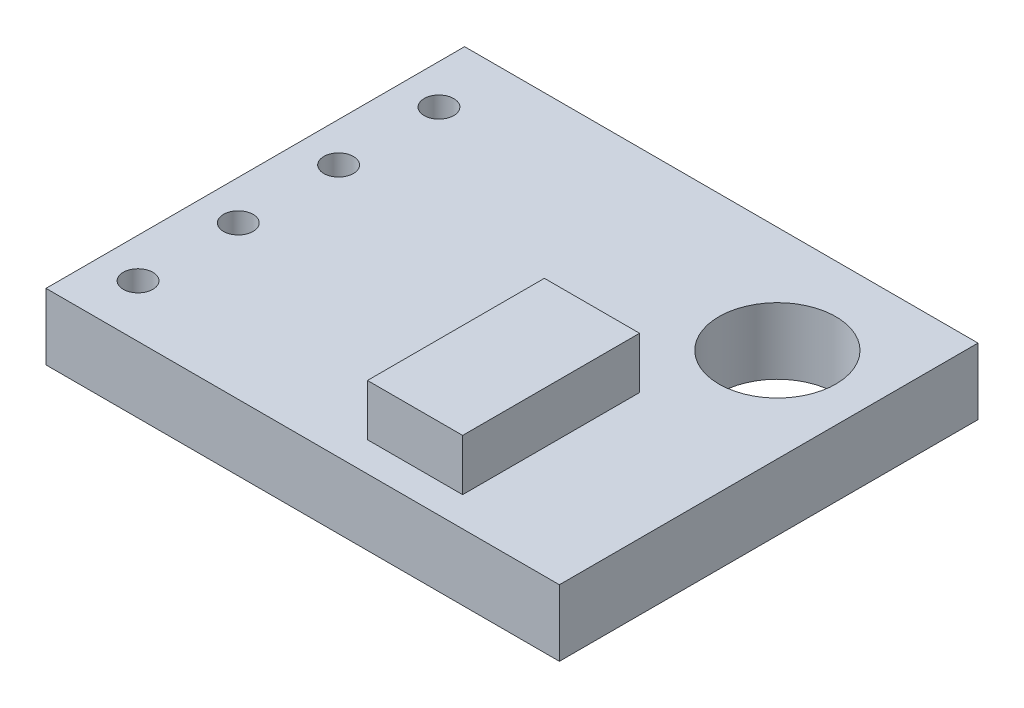
ISO-10303-21;
HEADER;
FILE_DESCRIPTION(('STEP AP214'),'2;1');
FILE_NAME('part.step','',(''),(''),'','','');
FILE_SCHEMA(('AUTOMOTIVE_DESIGN { 1 0 10303 214 1 1 1 1 }'));
ENDSEC;
DATA;
#1=APPLICATION_CONTEXT('core data for automotive mechanical design processes');
#2=APPLICATION_PROTOCOL_DEFINITION('international standard','automotive_design',2000,#1);
#3=PRODUCT_CONTEXT('',#1,'mechanical');
#4=PRODUCT('Part','Part','',(#3));
#5=PRODUCT_RELATED_PRODUCT_CATEGORY('part','',(#4));
#6=PRODUCT_DEFINITION_FORMATION('','',#4);
#7=PRODUCT_DEFINITION_CONTEXT('part definition',#1,'design');
#8=PRODUCT_DEFINITION('design','',#6,#7);
#9=PRODUCT_DEFINITION_SHAPE('','',#8);
#10=(LENGTH_UNIT() NAMED_UNIT(*) SI_UNIT(.MILLI.,.METRE.));
#11=(NAMED_UNIT(*) PLANE_ANGLE_UNIT() SI_UNIT($,.RADIAN.));
#12=(NAMED_UNIT(*) SI_UNIT($,.STERADIAN.) SOLID_ANGLE_UNIT());
#13=UNCERTAINTY_MEASURE_WITH_UNIT(LENGTH_MEASURE(1.E-05),#10,'distance_accuracy_value','');
#14=(GEOMETRIC_REPRESENTATION_CONTEXT(3) GLOBAL_UNCERTAINTY_ASSIGNED_CONTEXT((#13)) GLOBAL_UNIT_ASSIGNED_CONTEXT((#10,
#11,#12)) REPRESENTATION_CONTEXT('',''));
#15=CARTESIAN_POINT('',(0.,0.,0.));
#16=DIRECTION('',(0.,0.,1.));
#17=DIRECTION('',(1.,0.,0.));
#18=AXIS2_PLACEMENT_3D('',#15,#16,#17);
#19=CARTESIAN_POINT('',(6.5,1.68,-5.3));
#20=DIRECTION('',(-1.,0.,0.));
#21=DIRECTION('',(0.,0.,1.));
#22=AXIS2_PLACEMENT_3D('',#19,#20,#21);
#23=PLANE('',#22);
#24=DIRECTION('',(0.,0.,-1.));
#25=VECTOR('',#24,1.);
#26=CARTESIAN_POINT('',(6.5,0.,-5.3));
#27=LINE('',#26,#25);
#28=CARTESIAN_POINT('',(6.5,0.,5.3));
#29=VERTEX_POINT('',#28);
#30=CARTESIAN_POINT('',(6.5,0.,-5.3));
#31=VERTEX_POINT('',#30);
#32=EDGE_CURVE('E117',#29,#31,#27,.T.);
#33=ORIENTED_EDGE('',*,*,#32,.T.);
#34=DIRECTION('',(0.,-1.,0.));
#35=VECTOR('',#34,1.);
#36=CARTESIAN_POINT('',(6.5,1.68,-5.3));
#37=LINE('',#36,#35);
#38=CARTESIAN_POINT('',(6.5,1.68,-5.3));
#39=VERTEX_POINT('',#38);
#40=EDGE_CURVE('E11',#39,#31,#37,.T.);
#41=ORIENTED_EDGE('',*,*,#40,.F.);
#42=DIRECTION('',(0.,0.,-1.));
#43=VECTOR('',#42,1.);
#44=CARTESIAN_POINT('',(6.5,1.68,-5.3));
#45=LINE('',#44,#43);
#46=CARTESIAN_POINT('',(6.5,1.68,5.3));
#47=VERTEX_POINT('',#46);
#48=EDGE_CURVE('E126',#47,#39,#45,.T.);
#49=ORIENTED_EDGE('',*,*,#48,.F.);
#50=DIRECTION('',(0.,-1.,0.));
#51=VECTOR('',#50,1.);
#52=CARTESIAN_POINT('',(6.5,1.68,5.3));
#53=LINE('',#52,#51);
#54=EDGE_CURVE('E135',#47,#29,#53,.T.);
#55=ORIENTED_EDGE('',*,*,#54,.T.);
#56=EDGE_LOOP('',(#33,#41,#49,#55));
#57=FACE_BOUND('',#56,.T.);
#58=ADVANCED_FACE('F33',(#57),#23,.F.);
#59=CARTESIAN_POINT('',(-6.5,1.68,-5.3));
#60=DIRECTION('',(0.,0.,1.));
#61=DIRECTION('',(1.,0.,0.));
#62=AXIS2_PLACEMENT_3D('',#59,#60,#61);
#63=PLANE('',#62);
#64=DIRECTION('',(-1.,0.,0.));
#65=VECTOR('',#64,1.);
#66=CARTESIAN_POINT('',(-6.5,0.,-5.3));
#67=LINE('',#66,#65);
#68=CARTESIAN_POINT('',(-6.5,0.,-5.3));
#69=VERTEX_POINT('',#68);
#70=EDGE_CURVE('E120',#31,#69,#67,.T.);
#71=ORIENTED_EDGE('',*,*,#70,.T.);
#72=DIRECTION('',(0.,-1.,0.));
#73=VECTOR('',#72,1.);
#74=CARTESIAN_POINT('',(-6.5,1.68,-5.3));
#75=LINE('',#74,#73);
#76=CARTESIAN_POINT('',(-6.5,1.68,-5.3));
#77=VERTEX_POINT('',#76);
#78=EDGE_CURVE('E40',#77,#69,#75,.T.);
#79=ORIENTED_EDGE('',*,*,#78,.F.);
#80=DIRECTION('',(-1.,0.,0.));
#81=VECTOR('',#80,1.);
#82=CARTESIAN_POINT('',(-6.5,1.68,-5.3));
#83=LINE('',#82,#81);
#84=EDGE_CURVE('E129',#39,#77,#83,.T.);
#85=ORIENTED_EDGE('',*,*,#84,.F.);
#86=ORIENTED_EDGE('',*,*,#40,.T.);
#87=EDGE_LOOP('',(#71,#79,#85,#86));
#88=FACE_BOUND('',#87,.T.);
#89=ADVANCED_FACE('F166',(#88),#63,.F.);
#90=CARTESIAN_POINT('',(-6.5,1.68,-5.3));
#91=DIRECTION('',(1.,0.,0.));
#92=DIRECTION('',(0.,0.,-1.));
#93=AXIS2_PLACEMENT_3D('',#90,#91,#92);
#94=PLANE('',#93);
#95=DIRECTION('',(0.,0.,1.));
#96=VECTOR('',#95,1.);
#97=CARTESIAN_POINT('',(-6.5,0.,-5.3));
#98=LINE('',#97,#96);
#99=CARTESIAN_POINT('',(-6.5,0.,5.3));
#100=VERTEX_POINT('',#99);
#101=EDGE_CURVE('E138',#69,#100,#98,.T.);
#102=ORIENTED_EDGE('',*,*,#101,.T.);
#103=DIRECTION('',(0.,-1.,0.));
#104=VECTOR('',#103,1.);
#105=CARTESIAN_POINT('',(-6.5,1.68,5.3));
#106=LINE('',#105,#104);
#107=CARTESIAN_POINT('',(-6.5,1.68,5.3));
#108=VERTEX_POINT('',#107);
#109=EDGE_CURVE('E143',#108,#100,#106,.T.);
#110=ORIENTED_EDGE('',*,*,#109,.F.);
#111=DIRECTION('',(0.,0.,1.));
#112=VECTOR('',#111,1.);
#113=CARTESIAN_POINT('',(-6.5,1.68,-5.3));
#114=LINE('',#113,#112);
#115=EDGE_CURVE('E132',#77,#108,#114,.T.);
#116=ORIENTED_EDGE('',*,*,#115,.F.);
#117=ORIENTED_EDGE('',*,*,#78,.T.);
#118=EDGE_LOOP('',(#102,#110,#116,#117));
#119=FACE_BOUND('',#118,.T.);
#120=ADVANCED_FACE('F150',(#119),#94,.F.);
#121=CARTESIAN_POINT('',(-6.5,1.68,5.3));
#122=DIRECTION('',(0.,0.,-1.));
#123=DIRECTION('',(-1.,0.,0.));
#124=AXIS2_PLACEMENT_3D('',#121,#122,#123);
#125=PLANE('',#124);
#126=DIRECTION('',(1.,0.,0.));
#127=VECTOR('',#126,1.);
#128=CARTESIAN_POINT('',(-6.5,0.,5.3));
#129=LINE('',#128,#127);
#130=EDGE_CURVE('E130',#100,#29,#129,.T.);
#131=ORIENTED_EDGE('',*,*,#130,.T.);
#132=ORIENTED_EDGE('',*,*,#54,.F.);
#133=DIRECTION('',(1.,0.,0.));
#134=VECTOR('',#133,1.);
#135=CARTESIAN_POINT('',(-6.5,1.68,5.3));
#136=LINE('',#135,#134);
#137=EDGE_CURVE('E134',#108,#47,#136,.T.);
#138=ORIENTED_EDGE('',*,*,#137,.F.);
#139=ORIENTED_EDGE('',*,*,#109,.T.);
#140=EDGE_LOOP('',(#131,#132,#138,#139));
#141=FACE_BOUND('',#140,.T.);
#142=ADVANCED_FACE('F159',(#141),#125,.F.);
#143=CARTESIAN_POINT('',(0.,1.68,0.));
#144=DIRECTION('',(0.,1.,0.));
#145=DIRECTION('',(0.,0.,1.));
#146=AXIS2_PLACEMENT_3D('',#143,#144,#145);
#147=PLANE('',#146);
#148=CARTESIAN_POINT('',(-5.5,1.68,-3.65));
#149=DIRECTION('',(0.,1.,0.));
#150=DIRECTION('',(0.,0.,1.));
#151=AXIS2_PLACEMENT_3D('',#148,#149,#150);
#152=CIRCLE('',#151,0.375);
#153=CARTESIAN_POINT('',(-5.5,1.68,-3.275));
#154=VERTEX_POINT('',#153);
#155=EDGE_CURVE('E223',#154,#154,#152,.T.);
#156=ORIENTED_EDGE('',*,*,#155,.F.);
#157=EDGE_LOOP('',(#156));
#158=FACE_BOUND('',#157,.T.);
#159=CARTESIAN_POINT('',(-5.49999999999997,1.68,-1.11));
#160=DIRECTION('',(0.,1.,0.));
#161=DIRECTION('',(0.,0.,1.));
#162=AXIS2_PLACEMENT_3D('',#159,#160,#161);
#163=CIRCLE('',#162,0.375);
#164=CARTESIAN_POINT('',(-5.49999999999997,1.68,-0.735));
#165=VERTEX_POINT('',#164);
#166=EDGE_CURVE('E229',#165,#165,#163,.T.);
#167=ORIENTED_EDGE('',*,*,#166,.F.);
#168=EDGE_LOOP('',(#167));
#169=FACE_BOUND('',#168,.T.);
#170=CARTESIAN_POINT('',(-5.49999999999995,1.68,1.43));
#171=DIRECTION('',(0.,1.,0.));
#172=DIRECTION('',(0.,0.,1.));
#173=AXIS2_PLACEMENT_3D('',#170,#171,#172);
#174=CIRCLE('',#173,0.375);
#175=CARTESIAN_POINT('',(-5.49999999999995,1.68,1.805));
#176=VERTEX_POINT('',#175);
#177=EDGE_CURVE('E237',#176,#176,#174,.T.);
#178=ORIENTED_EDGE('',*,*,#177,.F.);
#179=EDGE_LOOP('',(#178));
#180=FACE_BOUND('',#179,.T.);
#181=CARTESIAN_POINT('',(-5.49999999999992,1.68,3.97));
#182=DIRECTION('',(0.,1.,0.));
#183=DIRECTION('',(0.,0.,1.));
#184=AXIS2_PLACEMENT_3D('',#181,#182,#183);
#185=CIRCLE('',#184,0.375);
#186=CARTESIAN_POINT('',(-5.49999999999992,1.68,4.345));
#187=VERTEX_POINT('',#186);
#188=EDGE_CURVE('E243',#187,#187,#185,.T.);
#189=ORIENTED_EDGE('',*,*,#188,.F.);
#190=EDGE_LOOP('',(#189));
#191=FACE_BOUND('',#190,.T.);
#192=CARTESIAN_POINT('',(4.12,1.68,-2.6));
#193=DIRECTION('',(0.,1.,0.));
#194=DIRECTION('',(0.,0.,1.));
#195=AXIS2_PLACEMENT_3D('',#192,#193,#194);
#196=CIRCLE('',#195,1.48);
#197=CARTESIAN_POINT('',(4.12,1.68,-1.12));
#198=VERTEX_POINT('',#197);
#199=EDGE_CURVE('E226',#198,#198,#196,.T.);
#200=ORIENTED_EDGE('',*,*,#199,.F.);
#201=EDGE_LOOP('',(#200));
#202=FACE_BOUND('',#201,.T.);
#203=DIRECTION('',(0.,0.,-1.));
#204=VECTOR('',#203,1.);
#205=CARTESIAN_POINT('',(3.3,1.68,0.0699999999999998));
#206=LINE('',#205,#204);
#207=CARTESIAN_POINT('',(3.3,1.68,4.55));
#208=VERTEX_POINT('',#207);
#209=CARTESIAN_POINT('',(3.3,1.68,0.0699999999999998));
#210=VERTEX_POINT('',#209);
#211=EDGE_CURVE('E47',#208,#210,#206,.T.);
#212=ORIENTED_EDGE('',*,*,#211,.F.);
#213=DIRECTION('',(1.,0.,0.));
#214=VECTOR('',#213,1.);
#215=CARTESIAN_POINT('',(0.890000000000001,1.68,4.55));
#216=LINE('',#215,#214);
#217=CARTESIAN_POINT('',(0.890000000000001,1.68,4.55));
#218=VERTEX_POINT('',#217);
#219=EDGE_CURVE('E51',#218,#208,#216,.T.);
#220=ORIENTED_EDGE('',*,*,#219,.F.);
#221=DIRECTION('',(0.,0.,1.));
#222=VECTOR('',#221,1.);
#223=CARTESIAN_POINT('',(0.89,1.68,0.0699999999999998));
#224=LINE('',#223,#222);
#225=CARTESIAN_POINT('',(0.89,1.68,0.0699999999999998));
#226=VERTEX_POINT('',#225);
#227=EDGE_CURVE('E257',#226,#218,#224,.T.);
#228=ORIENTED_EDGE('',*,*,#227,.F.);
#229=DIRECTION('',(-1.,0.,0.));
#230=VECTOR('',#229,1.);
#231=CARTESIAN_POINT('',(0.89,1.68,0.0699999999999998));
#232=LINE('',#231,#230);
#233=EDGE_CURVE('E255',#210,#226,#232,.T.);
#234=ORIENTED_EDGE('',*,*,#233,.F.);
#235=EDGE_LOOP('',(#212,#220,#228,#234));
#236=FACE_BOUND('',#235,.T.);
#237=ORIENTED_EDGE('',*,*,#48,.T.);
#238=ORIENTED_EDGE('',*,*,#84,.T.);
#239=ORIENTED_EDGE('',*,*,#115,.T.);
#240=ORIENTED_EDGE('',*,*,#137,.T.);
#241=EDGE_LOOP('',(#237,#238,#239,#240));
#242=FACE_BOUND('',#241,.T.);
#243=ADVANCED_FACE('F165',(#158,#169,#180,#191,#202,#236,#242),#147,.T.);
#244=CARTESIAN_POINT('',(0.,0.,0.));
#245=DIRECTION('',(0.,1.,0.));
#246=DIRECTION('',(0.,0.,1.));
#247=AXIS2_PLACEMENT_3D('',#244,#245,#246);
#248=PLANE('',#247);
#249=CARTESIAN_POINT('',(-5.5,0.,-3.65));
#250=DIRECTION('',(0.,1.,0.));
#251=DIRECTION('',(0.,0.,1.));
#252=AXIS2_PLACEMENT_3D('',#249,#250,#251);
#253=CIRCLE('',#252,0.375);
#254=CARTESIAN_POINT('',(-5.5,0.,-3.275));
#255=VERTEX_POINT('',#254);
#256=EDGE_CURVE('E220',#255,#255,#253,.T.);
#257=ORIENTED_EDGE('',*,*,#256,.T.);
#258=EDGE_LOOP('',(#257));
#259=FACE_BOUND('',#258,.T.);
#260=CARTESIAN_POINT('',(-5.49999999999997,0.,-1.11));
#261=DIRECTION('',(0.,1.,0.));
#262=DIRECTION('',(0.,0.,1.));
#263=AXIS2_PLACEMENT_3D('',#260,#261,#262);
#264=CIRCLE('',#263,0.375);
#265=CARTESIAN_POINT('',(-5.49999999999997,0.,-0.735));
#266=VERTEX_POINT('',#265);
#267=EDGE_CURVE('E224',#266,#266,#264,.T.);
#268=ORIENTED_EDGE('',*,*,#267,.T.);
#269=EDGE_LOOP('',(#268));
#270=FACE_BOUND('',#269,.T.);
#271=CARTESIAN_POINT('',(-5.49999999999995,0.,1.43));
#272=DIRECTION('',(0.,1.,0.));
#273=DIRECTION('',(0.,0.,1.));
#274=AXIS2_PLACEMENT_3D('',#271,#272,#273);
#275=CIRCLE('',#274,0.375);
#276=CARTESIAN_POINT('',(-5.49999999999995,0.,1.805));
#277=VERTEX_POINT('',#276);
#278=EDGE_CURVE('E234',#277,#277,#275,.T.);
#279=ORIENTED_EDGE('',*,*,#278,.T.);
#280=EDGE_LOOP('',(#279));
#281=FACE_BOUND('',#280,.T.);
#282=CARTESIAN_POINT('',(-5.49999999999992,0.,3.97));
#283=DIRECTION('',(0.,1.,0.));
#284=DIRECTION('',(0.,0.,1.));
#285=AXIS2_PLACEMENT_3D('',#282,#283,#284);
#286=CIRCLE('',#285,0.375);
#287=CARTESIAN_POINT('',(-5.49999999999992,0.,4.345));
#288=VERTEX_POINT('',#287);
#289=EDGE_CURVE('E240',#288,#288,#286,.T.);
#290=ORIENTED_EDGE('',*,*,#289,.T.);
#291=EDGE_LOOP('',(#290));
#292=FACE_BOUND('',#291,.T.);
#293=CARTESIAN_POINT('',(4.12,0.,-2.6));
#294=DIRECTION('',(0.,1.,0.));
#295=DIRECTION('',(0.,0.,1.));
#296=AXIS2_PLACEMENT_3D('',#293,#294,#295);
#297=CIRCLE('',#296,1.48);
#298=CARTESIAN_POINT('',(4.12,0.,-1.12));
#299=VERTEX_POINT('',#298);
#300=EDGE_CURVE('E246',#299,#299,#297,.T.);
#301=ORIENTED_EDGE('',*,*,#300,.T.);
#302=EDGE_LOOP('',(#301));
#303=FACE_BOUND('',#302,.T.);
#304=ORIENTED_EDGE('',*,*,#32,.F.);
#305=ORIENTED_EDGE('',*,*,#130,.F.);
#306=ORIENTED_EDGE('',*,*,#101,.F.);
#307=ORIENTED_EDGE('',*,*,#70,.F.);
#308=EDGE_LOOP('',(#304,#305,#306,#307));
#309=FACE_BOUND('',#308,.T.);
#310=ADVANCED_FACE('F156',(#259,#270,#281,#292,#303,#309),#248,.F.);
#311=CARTESIAN_POINT('',(3.3,2.98,0.0699999999999998));
#312=DIRECTION('',(-1.,0.,0.));
#313=DIRECTION('',(0.,0.,1.));
#314=AXIS2_PLACEMENT_3D('',#311,#312,#313);
#315=PLANE('',#314);
#316=ORIENTED_EDGE('',*,*,#211,.T.);
#317=DIRECTION('',(0.,-1.,0.));
#318=VECTOR('',#317,1.);
#319=CARTESIAN_POINT('',(3.3,2.98,0.0699999999999998));
#320=LINE('',#319,#318);
#321=CARTESIAN_POINT('',(3.3,2.98,0.0699999999999998));
#322=VERTEX_POINT('',#321);
#323=EDGE_CURVE('E100',#322,#210,#320,.T.);
#324=ORIENTED_EDGE('',*,*,#323,.F.);
#325=DIRECTION('',(0.,0.,-1.));
#326=VECTOR('',#325,1.);
#327=CARTESIAN_POINT('',(3.3,2.98,0.0699999999999998));
#328=LINE('',#327,#326);
#329=CARTESIAN_POINT('',(3.3,2.98,4.55));
#330=VERTEX_POINT('',#329);
#331=EDGE_CURVE('E106',#330,#322,#328,.T.);
#332=ORIENTED_EDGE('',*,*,#331,.F.);
#333=DIRECTION('',(0.,-1.,0.));
#334=VECTOR('',#333,1.);
#335=CARTESIAN_POINT('',(3.3,2.98,4.55));
#336=LINE('',#335,#334);
#337=EDGE_CURVE('E253',#330,#208,#336,.T.);
#338=ORIENTED_EDGE('',*,*,#337,.T.);
#339=EDGE_LOOP('',(#316,#324,#332,#338));
#340=FACE_BOUND('',#339,.T.);
#341=ADVANCED_FACE('F116',(#340),#315,.F.);
#342=CARTESIAN_POINT('',(0.89,2.98,0.0699999999999998));
#343=DIRECTION('',(0.,0.,1.));
#344=DIRECTION('',(1.,0.,0.));
#345=AXIS2_PLACEMENT_3D('',#342,#343,#344);
#346=PLANE('',#345);
#347=ORIENTED_EDGE('',*,*,#233,.T.);
#348=DIRECTION('',(0.,-1.,0.));
#349=VECTOR('',#348,1.);
#350=CARTESIAN_POINT('',(0.89,2.98,0.0699999999999998));
#351=LINE('',#350,#349);
#352=CARTESIAN_POINT('',(0.89,2.98,0.0699999999999998));
#353=VERTEX_POINT('',#352);
#354=EDGE_CURVE('E102',#353,#226,#351,.T.);
#355=ORIENTED_EDGE('',*,*,#354,.F.);
#356=DIRECTION('',(-1.,0.,0.));
#357=VECTOR('',#356,1.);
#358=CARTESIAN_POINT('',(0.89,2.98,0.0699999999999998));
#359=LINE('',#358,#357);
#360=EDGE_CURVE('E95',#322,#353,#359,.T.);
#361=ORIENTED_EDGE('',*,*,#360,.F.);
#362=ORIENTED_EDGE('',*,*,#323,.T.);
#363=EDGE_LOOP('',(#347,#355,#361,#362));
#364=FACE_BOUND('',#363,.T.);
#365=ADVANCED_FACE('F98',(#364),#346,.F.);
#366=CARTESIAN_POINT('',(0.89,2.98,0.0699999999999998));
#367=DIRECTION('',(1.,0.,0.));
#368=DIRECTION('',(0.,0.,-1.));
#369=AXIS2_PLACEMENT_3D('',#366,#367,#368);
#370=PLANE('',#369);
#371=ORIENTED_EDGE('',*,*,#227,.T.);
#372=DIRECTION('',(0.,-1.,0.));
#373=VECTOR('',#372,1.);
#374=CARTESIAN_POINT('',(0.890000000000001,2.98,4.55));
#375=LINE('',#374,#373);
#376=CARTESIAN_POINT('',(0.890000000000001,2.98,4.55));
#377=VERTEX_POINT('',#376);
#378=EDGE_CURVE('E122',#377,#218,#375,.T.);
#379=ORIENTED_EDGE('',*,*,#378,.F.);
#380=DIRECTION('',(0.,0.,1.));
#381=VECTOR('',#380,1.);
#382=CARTESIAN_POINT('',(0.89,2.98,0.0699999999999998));
#383=LINE('',#382,#381);
#384=EDGE_CURVE('E105',#353,#377,#383,.T.);
#385=ORIENTED_EDGE('',*,*,#384,.F.);
#386=ORIENTED_EDGE('',*,*,#354,.T.);
#387=EDGE_LOOP('',(#371,#379,#385,#386));
#388=FACE_BOUND('',#387,.T.);
#389=ADVANCED_FACE('F186',(#388),#370,.F.);
#390=CARTESIAN_POINT('',(0.890000000000001,2.98,4.55));
#391=DIRECTION('',(0.,0.,-1.));
#392=DIRECTION('',(-1.,0.,0.));
#393=AXIS2_PLACEMENT_3D('',#390,#391,#392);
#394=PLANE('',#393);
#395=ORIENTED_EDGE('',*,*,#219,.T.);
#396=ORIENTED_EDGE('',*,*,#337,.F.);
#397=DIRECTION('',(1.,0.,0.));
#398=VECTOR('',#397,1.);
#399=CARTESIAN_POINT('',(0.890000000000001,2.98,4.55));
#400=LINE('',#399,#398);
#401=EDGE_CURVE('E111',#377,#330,#400,.T.);
#402=ORIENTED_EDGE('',*,*,#401,.F.);
#403=ORIENTED_EDGE('',*,*,#378,.T.);
#404=EDGE_LOOP('',(#395,#396,#402,#403));
#405=FACE_BOUND('',#404,.T.);
#406=ADVANCED_FACE('F189',(#405),#394,.F.);
#407=CARTESIAN_POINT('',(0.,2.98,0.));
#408=DIRECTION('',(0.,1.,0.));
#409=DIRECTION('',(0.,0.,1.));
#410=AXIS2_PLACEMENT_3D('',#407,#408,#409);
#411=PLANE('',#410);
#412=ORIENTED_EDGE('',*,*,#331,.T.);
#413=ORIENTED_EDGE('',*,*,#360,.T.);
#414=ORIENTED_EDGE('',*,*,#384,.T.);
#415=ORIENTED_EDGE('',*,*,#401,.T.);
#416=EDGE_LOOP('',(#412,#413,#414,#415));
#417=FACE_BOUND('',#416,.T.);
#418=ADVANCED_FACE('F109',(#417),#411,.T.);
#419=CARTESIAN_POINT('',(4.12,0.,-2.6));
#420=DIRECTION('',(0.,1.,0.));
#421=DIRECTION('',(0.,0.,1.));
#422=AXIS2_PLACEMENT_3D('',#419,#420,#421);
#423=CYLINDRICAL_SURFACE('',#422,1.48);
#424=ORIENTED_EDGE('',*,*,#300,.F.);
#425=EDGE_LOOP('',(#424));
#426=FACE_BOUND('',#425,.T.);
#427=ORIENTED_EDGE('',*,*,#199,.T.);
#428=EDGE_LOOP('',(#427));
#429=FACE_BOUND('',#428,.T.);
#430=ADVANCED_FACE('F196',(#426,#429),#423,.F.);
#431=CARTESIAN_POINT('',(-5.49999999999992,0.,3.97));
#432=DIRECTION('',(0.,1.,0.));
#433=DIRECTION('',(0.,0.,1.));
#434=AXIS2_PLACEMENT_3D('',#431,#432,#433);
#435=CYLINDRICAL_SURFACE('',#434,0.375);
#436=ORIENTED_EDGE('',*,*,#289,.F.);
#437=EDGE_LOOP('',(#436));
#438=FACE_BOUND('',#437,.T.);
#439=ORIENTED_EDGE('',*,*,#188,.T.);
#440=EDGE_LOOP('',(#439));
#441=FACE_BOUND('',#440,.T.);
#442=ADVANCED_FACE('F199',(#438,#441),#435,.F.);
#443=CARTESIAN_POINT('',(-5.49999999999995,0.,1.43));
#444=DIRECTION('',(0.,1.,0.));
#445=DIRECTION('',(0.,0.,1.));
#446=AXIS2_PLACEMENT_3D('',#443,#444,#445);
#447=CYLINDRICAL_SURFACE('',#446,0.375);
#448=ORIENTED_EDGE('',*,*,#278,.F.);
#449=EDGE_LOOP('',(#448));
#450=FACE_BOUND('',#449,.T.);
#451=ORIENTED_EDGE('',*,*,#177,.T.);
#452=EDGE_LOOP('',(#451));
#453=FACE_BOUND('',#452,.T.);
#454=ADVANCED_FACE('F203',(#450,#453),#447,.F.);
#455=CARTESIAN_POINT('',(-5.49999999999997,0.,-1.11));
#456=DIRECTION('',(0.,1.,0.));
#457=DIRECTION('',(0.,0.,1.));
#458=AXIS2_PLACEMENT_3D('',#455,#456,#457);
#459=CYLINDRICAL_SURFACE('',#458,0.375);
#460=ORIENTED_EDGE('',*,*,#267,.F.);
#461=EDGE_LOOP('',(#460));
#462=FACE_BOUND('',#461,.T.);
#463=ORIENTED_EDGE('',*,*,#166,.T.);
#464=EDGE_LOOP('',(#463));
#465=FACE_BOUND('',#464,.T.);
#466=ADVANCED_FACE('F207',(#462,#465),#459,.F.);
#467=CARTESIAN_POINT('',(-5.5,0.,-3.65));
#468=DIRECTION('',(0.,1.,0.));
#469=DIRECTION('',(0.,0.,1.));
#470=AXIS2_PLACEMENT_3D('',#467,#468,#469);
#471=CYLINDRICAL_SURFACE('',#470,0.375);
#472=ORIENTED_EDGE('',*,*,#256,.F.);
#473=EDGE_LOOP('',(#472));
#474=FACE_BOUND('',#473,.T.);
#475=ORIENTED_EDGE('',*,*,#155,.T.);
#476=EDGE_LOOP('',(#475));
#477=FACE_BOUND('',#476,.T.);
#478=ADVANCED_FACE('F211',(#474,#477),#471,.F.);
#479=CLOSED_SHELL('',(#58,#89,#120,#142,#243,#310,#341,#365,#389,#406,#418,#430,#442,#454,#466,#478));
#480=MANIFOLD_SOLID_BREP('B2',#479);
#481=ADVANCED_BREP_SHAPE_REPRESENTATION('',(#18,#480),#14);
#482=SHAPE_DEFINITION_REPRESENTATION(#9,#481);
ENDSEC;
END-ISO-10303-21;
